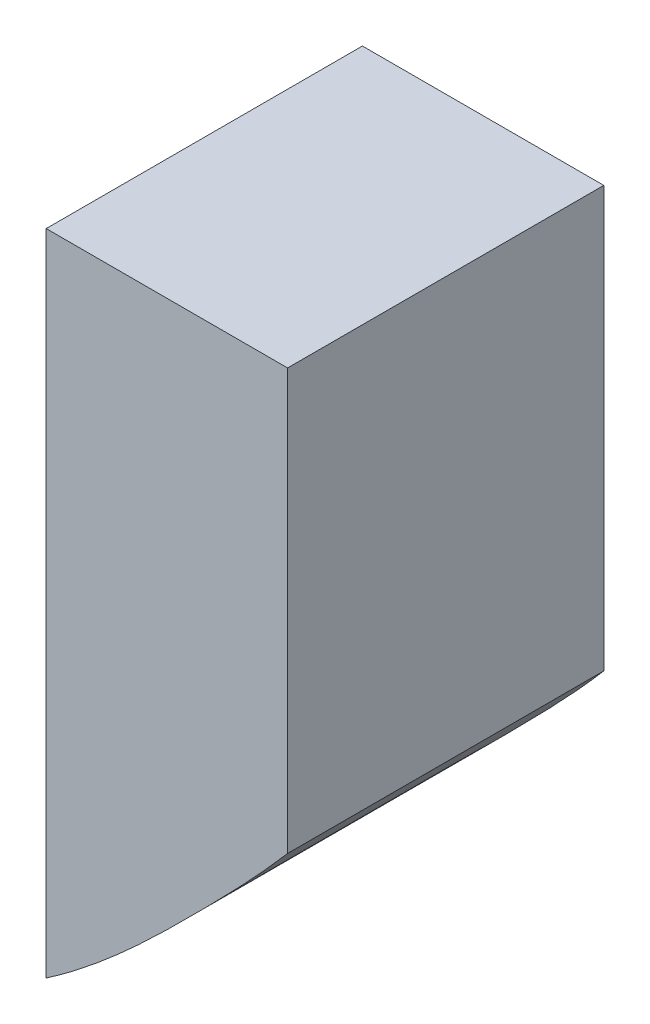
ISO-10303-21;
HEADER;
FILE_DESCRIPTION(('STEP AP214'),'2;1');
FILE_NAME('part.step','',(''),(''),'','','');
FILE_SCHEMA(('AUTOMOTIVE_DESIGN { 1 0 10303 214 1 1 1 1 }'));
ENDSEC;
DATA;
#1=APPLICATION_CONTEXT('core data for automotive mechanical design processes');
#2=APPLICATION_PROTOCOL_DEFINITION('international standard','automotive_design',2000,#1);
#3=PRODUCT_CONTEXT('',#1,'mechanical');
#4=PRODUCT('Part','Part','',(#3));
#5=PRODUCT_RELATED_PRODUCT_CATEGORY('part','',(#4));
#6=PRODUCT_DEFINITION_FORMATION('','',#4);
#7=PRODUCT_DEFINITION_CONTEXT('part definition',#1,'design');
#8=PRODUCT_DEFINITION('design','',#6,#7);
#9=PRODUCT_DEFINITION_SHAPE('','',#8);
#10=(LENGTH_UNIT() NAMED_UNIT(*) SI_UNIT(.MILLI.,.METRE.));
#11=(NAMED_UNIT(*) PLANE_ANGLE_UNIT() SI_UNIT($,.RADIAN.));
#12=(NAMED_UNIT(*) SI_UNIT($,.STERADIAN.) SOLID_ANGLE_UNIT());
#13=UNCERTAINTY_MEASURE_WITH_UNIT(LENGTH_MEASURE(1.E-05),#10,'distance_accuracy_value','');
#14=(GEOMETRIC_REPRESENTATION_CONTEXT(3) GLOBAL_UNCERTAINTY_ASSIGNED_CONTEXT((#13)) GLOBAL_UNIT_ASSIGNED_CONTEXT((#10,
#11,#12)) REPRESENTATION_CONTEXT('',''));
#15=CARTESIAN_POINT('',(0.,0.,0.));
#16=DIRECTION('',(0.,0.,1.));
#17=DIRECTION('',(1.,0.,0.));
#18=AXIS2_PLACEMENT_3D('',#15,#16,#17);
#19=CARTESIAN_POINT('',(69.8827461624665,2.25600000000003,35.9999999999997));
#20=DIRECTION('',(-0.999999999999993,1.147586851798E-07,0.));
#21=DIRECTION('',(-1.147586851798E-07,-0.999999999999993,0.));
#22=AXIS2_PLACEMENT_3D('',#19,#20,#21);
#23=PLANE('',#22);
#24=DIRECTION('',(-1.147586851798E-07,-0.999999999999993,0.));
#25=VECTOR('',#24,1.);
#26=CARTESIAN_POINT('',(69.8827461624665,2.25600000000003,43.9999999999997));
#27=LINE('',#26,#25);
#28=CARTESIAN_POINT('',(69.8827461624665,2.25600000000003,43.9999999999997));
#29=VERTEX_POINT('',#28);
#30=CARTESIAN_POINT('',(69.8827442780941,-14.164303343815,43.9999999999997));
#31=VERTEX_POINT('',#30);
#32=EDGE_CURVE('E141',#29,#31,#27,.T.);
#33=ORIENTED_EDGE('',*,*,#32,.F.);
#34=DIRECTION('',(0.,0.,1.));
#35=VECTOR('',#34,1.);
#36=CARTESIAN_POINT('',(69.8827461624665,2.25600000000003,35.9999999999997));
#37=LINE('',#36,#35);
#38=CARTESIAN_POINT('',(69.8827461624665,2.25600000000003,35.9999999999997));
#39=VERTEX_POINT('',#38);
#40=EDGE_CURVE('E11',#39,#29,#37,.T.);
#41=ORIENTED_EDGE('',*,*,#40,.F.);
#42=DIRECTION('',(-1.147586851798E-07,-0.999999999999993,0.));
#43=VECTOR('',#42,1.);
#44=CARTESIAN_POINT('',(69.8827461624665,2.25600000000003,35.9999999999997));
#45=LINE('',#44,#43);
#46=CARTESIAN_POINT('',(69.8827442780941,-14.164303343815,35.9999999999997));
#47=VERTEX_POINT('',#46);
#48=EDGE_CURVE('E96',#39,#47,#45,.T.);
#49=ORIENTED_EDGE('',*,*,#48,.T.);
#50=DIRECTION('',(0.,0.,1.));
#51=VECTOR('',#50,1.);
#52=CARTESIAN_POINT('',(69.8827442780941,-14.164303343815,35.9999999999997));
#53=LINE('',#52,#51);
#54=EDGE_CURVE('E73',#47,#31,#53,.T.);
#55=ORIENTED_EDGE('',*,*,#54,.T.);
#56=EDGE_LOOP('',(#33,#41,#49,#55));
#57=FACE_BOUND('',#56,.T.);
#58=ADVANCED_FACE('F30',(#57),#23,.T.);
#59=CARTESIAN_POINT('',(75.9901206831514,2.256,35.9999999999997));
#60=DIRECTION('',(0.,1.,0.));
#61=DIRECTION('',(-1.,0.,0.));
#62=AXIS2_PLACEMENT_3D('',#59,#60,#61);
#63=PLANE('',#62);
#64=DIRECTION('',(-1.,0.,0.));
#65=VECTOR('',#64,1.);
#66=CARTESIAN_POINT('',(75.9901206831514,2.256,43.9999999999997));
#67=LINE('',#66,#65);
#68=CARTESIAN_POINT('',(75.9901206831514,2.256,43.9999999999997));
#69=VERTEX_POINT('',#68);
#70=EDGE_CURVE('E152',#69,#29,#67,.T.);
#71=ORIENTED_EDGE('',*,*,#70,.F.);
#72=DIRECTION('',(0.,0.,1.));
#73=VECTOR('',#72,1.);
#74=CARTESIAN_POINT('',(75.9901206831514,2.256,35.9999999999997));
#75=LINE('',#74,#73);
#76=CARTESIAN_POINT('',(75.9901206831514,2.256,35.9999999999997));
#77=VERTEX_POINT('',#76);
#78=EDGE_CURVE('E39',#77,#69,#75,.T.);
#79=ORIENTED_EDGE('',*,*,#78,.F.);
#80=DIRECTION('',(-1.,0.,0.));
#81=VECTOR('',#80,1.);
#82=CARTESIAN_POINT('',(75.9901206831514,2.256,35.9999999999997));
#83=LINE('',#82,#81);
#84=EDGE_CURVE('E91',#77,#39,#83,.T.);
#85=ORIENTED_EDGE('',*,*,#84,.T.);
#86=ORIENTED_EDGE('',*,*,#40,.T.);
#87=EDGE_LOOP('',(#71,#79,#85,#86));
#88=FACE_BOUND('',#87,.T.);
#89=ADVANCED_FACE('F178',(#88),#63,.T.);
#90=CARTESIAN_POINT('',(314.398861118895,-1986.08323700662,35.9999999999997));
#91=CARTESIAN_POINT('',(75.1936055267861,-1325.6870242995,35.9999999999997));
#92=CARTESIAN_POINT('',(75.9833578220219,-665.292149430966,35.9999999999997));
#93=CARTESIAN_POINT('',(75.990087391172,-3.82589805873751,35.9999999999997));
#94=CARTESIAN_POINT('',(75.9900963343568,-2.75452941079104,35.9999999999997));
#95=CARTESIAN_POINT('',(75.994512503414,665.367444792053,35.9999999999997));
#96=CARTESIAN_POINT('',(75.2914968663911,1332.41805581839,35.9999999999997));
#97=CARTESIAN_POINT('',(3.25494451131814,1999.46639115973,35.9999999999997));
#98=B_SPLINE_CURVE_WITH_KNOTS('',3,(#90,#91,#92,#93,#94,#95,#96,#97),.UNSPECIFIED.,.F.,.F.,(4,2,
2,4),(-199.498459061191,0.351560555941649,0.67578027796875,202.539968037645),.UNSPECIFIED.);
#99=DIRECTION('',(0.,0.,1.));
#100=VECTOR('',#99,1.);
#101=SURFACE_OF_LINEAR_EXTRUSION('',#98,#100);
#102=CARTESIAN_POINT('',(75.9901206910434,2.25600186394648,43.9999999999997));
#103=CARTESIAN_POINT('',(75.990118032912,0.942947655010023,43.9999999999997));
#104=CARTESIAN_POINT('',(75.9901120949736,-0.370106553922628,43.9999999999997));
#105=CARTESIAN_POINT('',(75.9900963343568,-2.75452941079104,43.9999999999997));
#106=CARTESIAN_POINT('',(75.990087391172,-3.82589805873751,43.9999999999997));
#107=CARTESIAN_POINT('',(75.990064672414,-6.05898183962251,43.9999999999997));
#108=CARTESIAN_POINT('',(75.9900504303498,-7.22069697255826,43.9999999999997));
#109=CARTESIAN_POINT('',(75.9900350758846,-8.38241210547702,43.9999999999997));
#110=B_SPLINE_CURVE_WITH_KNOTS('',3,(#102,#103,#104,#105,#106,#107,#108,#109),.UNSPECIFIED.,.F.,
.F.,(4,2,2,4),(0.,0.397359089638851,0.721578811665952,1.0731393676076),.UNSPECIFIED.);
#111=CARTESIAN_POINT('',(75.9900350758846,-8.38241210547691,43.9999999999997));
#112=VERTEX_POINT('',#111);
#113=EDGE_CURVE('E82',#112,#69,#110,.F.);
#114=ORIENTED_EDGE('',*,*,#113,.F.);
#115=DIRECTION('',(0.,0.,1.));
#116=VECTOR('',#115,1.);
#117=CARTESIAN_POINT('',(75.9900350758846,-8.38241210547691,35.9999999999997));
#118=LINE('',#117,#116);
#119=CARTESIAN_POINT('',(75.9900350758846,-8.38241210547691,35.9999999999997));
#120=VERTEX_POINT('',#119);
#121=EDGE_CURVE('E76',#120,#112,#118,.T.);
#122=ORIENTED_EDGE('',*,*,#121,.F.);
#123=CARTESIAN_POINT('',(75.9900350758846,-8.38241210547702,35.9999999999997));
#124=CARTESIAN_POINT('',(75.9900504303498,-7.22069697255826,35.9999999999997));
#125=CARTESIAN_POINT('',(75.990064672414,-6.05898183962251,35.9999999999997));
#126=CARTESIAN_POINT('',(75.990087391172,-3.82589805873751,35.9999999999997));
#127=CARTESIAN_POINT('',(75.9900963343568,-2.75452941079104,35.9999999999997));
#128=CARTESIAN_POINT('',(75.9901120949695,-0.370107175238125,35.9999999999997));
#129=CARTESIAN_POINT('',(75.9901180329064,0.942946412379031,35.9999999999997));
#130=CARTESIAN_POINT('',(75.9901206910396,2.25599999999999,35.9999999999997));
#131=B_SPLINE_CURVE_WITH_KNOTS('',3,(#123,#124,#125,#126,#127,#128,#129,#130),.UNSPECIFIED.,.F.,
.F.,(4,2,2,4),(0.,0.351560555941649,0.67578027796875,1.07313917958386),.UNSPECIFIED.);
#132=EDGE_CURVE('E79',#120,#77,#131,.T.);
#133=ORIENTED_EDGE('',*,*,#132,.T.);
#134=ORIENTED_EDGE('',*,*,#78,.T.);
#135=EDGE_LOOP('',(#114,#122,#133,#134));
#136=FACE_BOUND('',#135,.T.);
#137=ADVANCED_FACE('F78',(#136),#101,.T.);
#138=CARTESIAN_POINT('',(69.8827442780941,-14.164303343815,35.9999999999997));
#139=CARTESIAN_POINT('',(70.4656468655499,-13.7682709481059,35.9999999999997));
#140=CARTESIAN_POINT('',(71.0136160061954,-13.3309197564148,35.9999999999997));
#141=CARTESIAN_POINT('',(72.07327189865,-12.4133030671327,35.9999999999997));
#142=CARTESIAN_POINT('',(72.5827825706089,-11.9304637324998,35.9999999999997));
#143=CARTESIAN_POINT('',(73.5847933115942,-10.9446651581998,35.9999999999997));
#144=CARTESIAN_POINT('',(74.0793010275891,-10.4435758558883,35.9999999999997));
#145=CARTESIAN_POINT('',(75.055656094536,-9.43151123075292,35.9999999999997));
#146=CARTESIAN_POINT('',(75.5334068566956,-8.9162796262984,35.9999999999997));
#147=CARTESIAN_POINT('',(75.9900350758846,-8.38241210547691,35.9999999999997));
#148=B_SPLINE_CURVE_WITH_KNOTS('',3,(#138,#139,#140,#141,#142,#143,#144,#145,#146,#147),
.UNSPECIFIED.,.F.,.F.,(4,2,2,2,4),(0.,0.25,0.5,0.75,1.),.UNSPECIFIED.);
#149=DIRECTION('',(0.,0.,1.));
#150=VECTOR('',#149,1.);
#151=SURFACE_OF_LINEAR_EXTRUSION('',#148,#150);
#152=CARTESIAN_POINT('',(75.9900350758846,-8.38241210547691,43.9999999999997));
#153=CARTESIAN_POINT('',(75.5334068566956,-8.9162796262984,43.9999999999997));
#154=CARTESIAN_POINT('',(75.055656094536,-9.43151123075292,43.9999999999997));
#155=CARTESIAN_POINT('',(74.0793010275891,-10.4435758558883,43.9999999999997));
#156=CARTESIAN_POINT('',(73.5847933115942,-10.9446651581998,43.9999999999997));
#157=CARTESIAN_POINT('',(72.5827825706089,-11.9304637324998,43.9999999999997));
#158=CARTESIAN_POINT('',(72.07327189865,-12.4133030671327,43.9999999999997));
#159=CARTESIAN_POINT('',(71.0136160061954,-13.3309197564148,43.9999999999997));
#160=CARTESIAN_POINT('',(70.4656468655499,-13.7682709481059,43.9999999999997));
#161=CARTESIAN_POINT('',(69.8827442780941,-14.164303343815,43.9999999999997));
#162=B_SPLINE_CURVE_WITH_KNOTS('',3,(#152,#153,#154,#155,#156,#157,#158,#159,#160,#161),
.UNSPECIFIED.,.F.,.F.,(4,2,2,2,4),(0.,0.25,0.5,0.75,1.),.UNSPECIFIED.);
#163=EDGE_CURVE('E148',#31,#112,#162,.F.);
#164=ORIENTED_EDGE('',*,*,#163,.F.);
#165=ORIENTED_EDGE('',*,*,#54,.F.);
#166=CARTESIAN_POINT('',(69.8827442780941,-14.164303343815,35.9999999999997));
#167=CARTESIAN_POINT('',(70.4656468655499,-13.7682709481059,35.9999999999997));
#168=CARTESIAN_POINT('',(71.0136160061954,-13.3309197564148,35.9999999999997));
#169=CARTESIAN_POINT('',(72.07327189865,-12.4133030671327,35.9999999999997));
#170=CARTESIAN_POINT('',(72.5827825706089,-11.9304637324998,35.9999999999997));
#171=CARTESIAN_POINT('',(73.5847933115942,-10.9446651581998,35.9999999999997));
#172=CARTESIAN_POINT('',(74.0793010275891,-10.4435758558883,35.9999999999997));
#173=CARTESIAN_POINT('',(75.055656094536,-9.43151123075292,35.9999999999997));
#174=CARTESIAN_POINT('',(75.5334068566956,-8.9162796262984,35.9999999999997));
#175=CARTESIAN_POINT('',(75.9900350758846,-8.38241210547691,35.9999999999997));
#176=B_SPLINE_CURVE_WITH_KNOTS('',3,(#166,#167,#168,#169,#170,#171,#172,#173,#174,#175),
.UNSPECIFIED.,.F.,.F.,(4,2,2,2,4),(0.,0.25,0.5,0.75,1.),.UNSPECIFIED.);
#177=EDGE_CURVE('E89',#47,#120,#176,.T.);
#178=ORIENTED_EDGE('',*,*,#177,.T.);
#179=ORIENTED_EDGE('',*,*,#121,.T.);
#180=EDGE_LOOP('',(#164,#165,#178,#179));
#181=FACE_BOUND('',#180,.T.);
#182=ADVANCED_FACE('F95',(#181),#151,.T.);
#183=CARTESIAN_POINT('',(73.0837879411016,-11.4375644453498,35.9999999999997));
#184=DIRECTION('',(0.,0.,-1.));
#185=DIRECTION('',(-1.,0.,0.));
#186=AXIS2_PLACEMENT_3D('',#183,#184,#185);
#187=PLANE('',#186);
#188=ORIENTED_EDGE('',*,*,#48,.F.);
#189=ORIENTED_EDGE('',*,*,#84,.F.);
#190=ORIENTED_EDGE('',*,*,#132,.F.);
#191=ORIENTED_EDGE('',*,*,#177,.F.);
#192=EDGE_LOOP('',(#188,#189,#190,#191));
#193=FACE_BOUND('',#192,.T.);
#194=ADVANCED_FACE('F88',(#193),#187,.T.);
#195=CARTESIAN_POINT('',(73.0837879411016,-11.4375644453498,43.9999999999997));
#196=DIRECTION('',(0.,0.,-1.));
#197=DIRECTION('',(-1.,0.,0.));
#198=AXIS2_PLACEMENT_3D('',#195,#196,#197);
#199=PLANE('',#198);
#200=ORIENTED_EDGE('',*,*,#32,.T.);
#201=ORIENTED_EDGE('',*,*,#163,.T.);
#202=ORIENTED_EDGE('',*,*,#113,.T.);
#203=ORIENTED_EDGE('',*,*,#70,.T.);
#204=EDGE_LOOP('',(#200,#201,#202,#203));
#205=FACE_BOUND('',#204,.T.);
#206=ADVANCED_FACE('F168',(#205),#199,.F.);
#207=CLOSED_SHELL('',(#58,#89,#137,#182,#194,#206));
#208=MANIFOLD_SOLID_BREP('B2',#207);
#209=ADVANCED_BREP_SHAPE_REPRESENTATION('',(#18,#208),#14);
#210=SHAPE_DEFINITION_REPRESENTATION(#9,#209);
ENDSEC;
END-ISO-10303-21;
